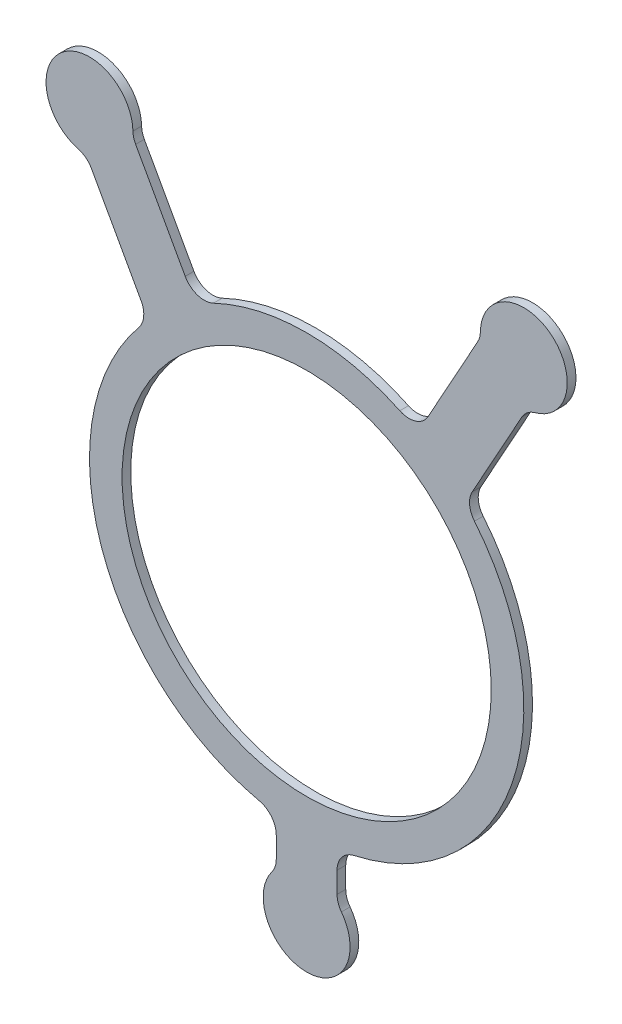
ISO-10303-21;
HEADER;
FILE_DESCRIPTION(('STEP AP214'),'2;1');
FILE_NAME('part.step','',(''),(''),'','','');
FILE_SCHEMA(('AUTOMOTIVE_DESIGN { 1 0 10303 214 1 1 1 1 }'));
ENDSEC;
DATA;
#1=APPLICATION_CONTEXT('core data for automotive mechanical design processes');
#2=APPLICATION_PROTOCOL_DEFINITION('international standard','automotive_design',2000,#1);
#3=PRODUCT_CONTEXT('',#1,'mechanical');
#4=PRODUCT('Part','Part','',(#3));
#5=PRODUCT_RELATED_PRODUCT_CATEGORY('part','',(#4));
#6=PRODUCT_DEFINITION_FORMATION('','',#4);
#7=PRODUCT_DEFINITION_CONTEXT('part definition',#1,'design');
#8=PRODUCT_DEFINITION('design','',#6,#7);
#9=PRODUCT_DEFINITION_SHAPE('','',#8);
#10=(LENGTH_UNIT() NAMED_UNIT(*) SI_UNIT(.MILLI.,.METRE.));
#11=(NAMED_UNIT(*) PLANE_ANGLE_UNIT() SI_UNIT($,.RADIAN.));
#12=(NAMED_UNIT(*) SI_UNIT($,.STERADIAN.) SOLID_ANGLE_UNIT());
#13=UNCERTAINTY_MEASURE_WITH_UNIT(LENGTH_MEASURE(1.E-05),#10,'distance_accuracy_value','');
#14=(GEOMETRIC_REPRESENTATION_CONTEXT(3) GLOBAL_UNCERTAINTY_ASSIGNED_CONTEXT((#13)) GLOBAL_UNIT_ASSIGNED_CONTEXT((#10,
#11,#12)) REPRESENTATION_CONTEXT('',''));
#15=CARTESIAN_POINT('',(0.,0.,0.));
#16=DIRECTION('',(0.,0.,1.));
#17=DIRECTION('',(1.,0.,0.));
#18=AXIS2_PLACEMENT_3D('',#15,#16,#17);
#19=CARTESIAN_POINT('',(-53.9762118068196,130.059986849951,2.54));
#20=DIRECTION('',(0.,0.,-1.));
#21=DIRECTION('',(-1.,0.,0.));
#22=AXIS2_PLACEMENT_3D('',#19,#20,#21);
#23=PLANE('',#22);
#24=CARTESIAN_POINT('',(-53.9762118068196,130.059986849951,2.54));
#25=DIRECTION('',(0.,0.,-1.));
#26=DIRECTION('',(-1.,0.,0.));
#27=AXIS2_PLACEMENT_3D('',#24,#25,#26);
#28=CIRCLE('',#27,6.34999999999999);
#29=CARTESIAN_POINT('',(-48.4212219063758,133.136443774071,2.54));
#30=VERTEX_POINT('',#29);
#31=CARTESIAN_POINT('',(-49.0692834607451,126.029533499956,2.54));
#32=VERTEX_POINT('',#31);
#33=EDGE_CURVE('E277',#30,#32,#28,.T.);
#34=ORIENTED_EDGE('',*,*,#33,.T.);
#35=CARTESIAN_POINT('',(0.,85.725,2.54));
#36=DIRECTION('',(0.,0.,1.));
#37=DIRECTION('',(1.,0.,0.));
#38=AXIS2_PLACEMENT_3D('',#35,#36,#37);
#39=CIRCLE('',#38,63.5);
#40=CARTESIAN_POINT('',(-13.8545454545455,23.7548332239784,2.54));
#41=VERTEX_POINT('',#40);
#42=EDGE_CURVE('E145',#32,#41,#39,.T.);
#43=ORIENTED_EDGE('',*,*,#42,.T.);
#44=CARTESIAN_POINT('',(-15.24,17.5578165463762,2.54));
#45=DIRECTION('',(0.,0.,-1.));
#46=DIRECTION('',(-1.,0.,0.));
#47=AXIS2_PLACEMENT_3D('',#44,#45,#46);
#48=CIRCLE('',#47,6.35);
#49=CARTESIAN_POINT('',(-8.89,17.5578165463762,2.54));
#50=VERTEX_POINT('',#49);
#51=EDGE_CURVE('E340',#41,#50,#48,.T.);
#52=ORIENTED_EDGE('',*,*,#51,.T.);
#53=DIRECTION('',(0.,-1.,0.));
#54=VECTOR('',#53,1.);
#55=CARTESIAN_POINT('',(-8.89,11.43,2.54));
#56=LINE('',#55,#54);
#57=CARTESIAN_POINT('',(-8.89,11.43,2.54));
#58=VERTEX_POINT('',#57);
#59=EDGE_CURVE('E359',#50,#58,#56,.T.);
#60=ORIENTED_EDGE('',*,*,#59,.T.);
#61=CARTESIAN_POINT('',(-15.24,11.43,2.54));
#62=DIRECTION('',(0.,0.,-1.));
#63=DIRECTION('',(-1.,0.,0.));
#64=AXIS2_PLACEMENT_3D('',#61,#62,#63);
#65=CIRCLE('',#64,6.35);
#66=CARTESIAN_POINT('',(-10.16,7.62,2.54));
#67=VERTEX_POINT('',#66);
#68=EDGE_CURVE('E356',#58,#67,#65,.T.);
#69=ORIENTED_EDGE('',*,*,#68,.T.);
#70=CARTESIAN_POINT('',(0.,0.,2.54));
#71=DIRECTION('',(0.,0.,1.));
#72=DIRECTION('',(1.,0.,0.));
#73=AXIS2_PLACEMENT_3D('',#70,#71,#72);
#74=CIRCLE('',#73,12.7);
#75=CARTESIAN_POINT('',(10.16,7.62,2.54));
#76=VERTEX_POINT('',#75);
#77=EDGE_CURVE('E358',#67,#76,#74,.T.);
#78=ORIENTED_EDGE('',*,*,#77,.T.);
#79=CARTESIAN_POINT('',(15.24,11.43,2.54));
#80=DIRECTION('',(0.,0.,-1.));
#81=DIRECTION('',(-1.,0.,0.));
#82=AXIS2_PLACEMENT_3D('',#79,#80,#81);
#83=CIRCLE('',#82,6.35);
#84=CARTESIAN_POINT('',(8.89,11.43,2.54));
#85=VERTEX_POINT('',#84);
#86=EDGE_CURVE('E361',#76,#85,#83,.T.);
#87=ORIENTED_EDGE('',*,*,#86,.T.);
#88=DIRECTION('',(0.,1.,0.));
#89=VECTOR('',#88,1.);
#90=CARTESIAN_POINT('',(8.89,11.43,2.54));
#91=LINE('',#90,#89);
#92=CARTESIAN_POINT('',(8.89,17.5578165463762,2.54));
#93=VERTEX_POINT('',#92);
#94=EDGE_CURVE('E367',#85,#93,#91,.T.);
#95=ORIENTED_EDGE('',*,*,#94,.T.);
#96=CARTESIAN_POINT('',(15.24,17.5578165463762,2.54));
#97=DIRECTION('',(0.,0.,-1.));
#98=DIRECTION('',(-1.,0.,0.));
#99=AXIS2_PLACEMENT_3D('',#96,#97,#98);
#100=CIRCLE('',#99,6.35);
#101=CARTESIAN_POINT('',(13.8545454545455,23.7548332239784,2.54));
#102=VERTEX_POINT('',#101);
#103=EDGE_CURVE('E369',#93,#102,#100,.T.);
#104=ORIENTED_EDGE('',*,*,#103,.T.);
#105=CARTESIAN_POINT('',(0.,85.725,2.54));
#106=DIRECTION('',(0.,0.,1.));
#107=DIRECTION('',(1.,0.,0.));
#108=AXIS2_PLACEMENT_3D('',#105,#106,#107);
#109=CIRCLE('',#108,63.5);
#110=CARTESIAN_POINT('',(49.0692834607453,126.029533499955,2.54));
#111=VERTEX_POINT('',#110);
#112=EDGE_CURVE('E371',#102,#111,#109,.T.);
#113=ORIENTED_EDGE('',*,*,#112,.T.);
#114=CARTESIAN_POINT('',(53.9762118068198,130.059986849951,2.54));
#115=DIRECTION('',(0.,0.,-1.));
#116=DIRECTION('',(-1.,0.,0.));
#117=AXIS2_PLACEMENT_3D('',#114,#115,#116);
#118=CIRCLE('',#117,6.34999999999999);
#119=CARTESIAN_POINT('',(48.4212219063759,133.136443774071,2.54));
#120=VERTEX_POINT('',#119);
#121=EDGE_CURVE('E373',#111,#120,#118,.T.);
#122=ORIENTED_EDGE('',*,*,#121,.T.);
#123=DIRECTION('',(0.484481405373256,0.874801559125014,0.));
#124=VECTOR('',#123,1.);
#125=CARTESIAN_POINT('',(62.9176901553753,159.31192313279,2.54));
#126=LINE('',#125,#124);
#127=CARTESIAN_POINT('',(62.9176901553753,159.31192313279,2.54));
#128=VERTEX_POINT('',#127);
#129=EDGE_CURVE('E375',#120,#128,#126,.T.);
#130=ORIENTED_EDGE('',*,*,#129,.T.);
#131=CARTESIAN_POINT('',(68.4726800558191,156.23546620867,2.54));
#132=DIRECTION('',(0.,0.,-1.));
#133=DIRECTION('',(-1.,0.,0.));
#134=AXIS2_PLACEMENT_3D('',#131,#132,#133);
#135=CIRCLE('',#134,6.35);
#136=CARTESIAN_POINT('',(66.8151200372129,162.36531080578,2.54));
#137=VERTEX_POINT('',#136);
#138=EDGE_CURVE('E377',#128,#137,#135,.T.);
#139=ORIENTED_EDGE('',*,*,#138,.T.);
#140=CARTESIAN_POINT('',(63.5000000000005,174.625,2.54));
#141=DIRECTION('',(0.,0.,1.));
#142=DIRECTION('',(-1.,0.,0.));
#143=AXIS2_PLACEMENT_3D('',#140,#141,#142);
#144=CIRCLE('',#143,12.7);
#145=CARTESIAN_POINT('',(50.8024647631299,174.875197738658,2.54));
#146=VERTEX_POINT('',#145);
#147=EDGE_CURVE('E379',#137,#146,#144,.T.);
#148=ORIENTED_EDGE('',*,*,#147,.T.);
#149=CARTESIAN_POINT('',(44.4536971446946,175.000296607987,2.54));
#150=DIRECTION('',(0.,0.,-1.));
#151=DIRECTION('',(1.,0.,0.));
#152=AXIS2_PLACEMENT_3D('',#149,#150,#151);
#153=CIRCLE('',#152,6.35);
#154=CARTESIAN_POINT('',(50.008687045138,171.923839683866,2.54));
#155=VERTEX_POINT('',#154);
#156=EDGE_CURVE('E381',#146,#155,#153,.T.);
#157=ORIENTED_EDGE('',*,*,#156,.T.);
#158=DIRECTION('',(-0.48448140537337,-0.87480155912495,0.));
#159=VECTOR('',#158,1.);
#160=CARTESIAN_POINT('',(50.008687045138,171.923839683866,2.54));
#161=LINE('',#160,#159);
#162=CARTESIAN_POINT('',(35.5122187961348,145.748360325148,2.54));
#163=VERTEX_POINT('',#162);
#164=EDGE_CURVE('E383',#155,#163,#161,.T.);
#165=ORIENTED_EDGE('',*,*,#164,.T.);
#166=CARTESIAN_POINT('',(29.9572288956914,148.824817249269,2.54));
#167=DIRECTION('',(0.,0.,-1.));
#168=DIRECTION('',(-1.,0.,0.));
#169=AXIS2_PLACEMENT_3D('',#166,#167,#168);
#170=CIRCLE('',#169,6.34999999999999);
#171=CARTESIAN_POINT('',(27.2338444506285,143.088470226608,2.54));
#172=VERTEX_POINT('',#171);
#173=EDGE_CURVE('E385',#163,#172,#170,.T.);
#174=ORIENTED_EDGE('',*,*,#173,.T.);
#175=CARTESIAN_POINT('',(0.,85.725,2.54));
#176=DIRECTION('',(0.,0.,1.));
#177=DIRECTION('',(1.,0.,0.));
#178=AXIS2_PLACEMENT_3D('',#175,#176,#177);
#179=CIRCLE('',#178,63.5);
#180=CARTESIAN_POINT('',(-27.2338444506317,143.088470226607,2.54));
#181=VERTEX_POINT('',#180);
#182=EDGE_CURVE('E387',#172,#181,#179,.T.);
#183=ORIENTED_EDGE('',*,*,#182,.T.);
#184=CARTESIAN_POINT('',(-29.9572288956949,148.824817249267,2.54));
#185=DIRECTION('',(0.,0.,-1.));
#186=DIRECTION('',(-1.,0.,0.));
#187=AXIS2_PLACEMENT_3D('',#184,#185,#186);
#188=CIRCLE('',#187,6.35);
#189=CARTESIAN_POINT('',(-35.5122187961387,145.748360325147,2.54));
#190=VERTEX_POINT('',#189);
#191=EDGE_CURVE('E389',#181,#190,#188,.T.);
#192=ORIENTED_EDGE('',*,*,#191,.T.);
#193=DIRECTION('',(-0.484481405373266,0.874801559125008,0.));
#194=VECTOR('',#193,1.);
#195=CARTESIAN_POINT('',(-50.0086870451384,171.923839683866,2.54));
#196=LINE('',#195,#194);
#197=CARTESIAN_POINT('',(-50.0086870451384,171.923839683866,2.54));
#198=VERTEX_POINT('',#197);
#199=EDGE_CURVE('E391',#190,#198,#196,.T.);
#200=ORIENTED_EDGE('',*,*,#199,.T.);
#201=CARTESIAN_POINT('',(-44.4536971446946,175.000296607986,2.54));
#202=DIRECTION('',(0.,0.,-1.));
#203=DIRECTION('',(-1.,0.,0.));
#204=AXIS2_PLACEMENT_3D('',#201,#202,#203);
#205=CIRCLE('',#204,6.34999999999999);
#206=CARTESIAN_POINT('',(-50.8024647631299,174.875197738658,2.54));
#207=VERTEX_POINT('',#206);
#208=EDGE_CURVE('E212',#198,#207,#205,.T.);
#209=ORIENTED_EDGE('',*,*,#208,.T.);
#210=CARTESIAN_POINT('',(-63.5000000000005,174.625,2.54));
#211=DIRECTION('',(0.,0.,1.));
#212=DIRECTION('',(1.,0.,0.));
#213=AXIS2_PLACEMENT_3D('',#210,#211,#212);
#214=CIRCLE('',#213,12.7);
#215=CARTESIAN_POINT('',(-66.815120037213,162.36531080578,2.54));
#216=VERTEX_POINT('',#215);
#217=EDGE_CURVE('E206',#207,#216,#214,.T.);
#218=ORIENTED_EDGE('',*,*,#217,.T.);
#219=CARTESIAN_POINT('',(-68.4726800558193,156.23546620867,2.54));
#220=DIRECTION('',(0.,0.,-1.));
#221=DIRECTION('',(-1.,0.,0.));
#222=AXIS2_PLACEMENT_3D('',#219,#220,#221);
#223=CIRCLE('',#222,6.35);
#224=CARTESIAN_POINT('',(-62.9176901553755,159.31192313279,2.54));
#225=VERTEX_POINT('',#224);
#226=EDGE_CURVE('E210',#216,#225,#223,.T.);
#227=ORIENTED_EDGE('',*,*,#226,.T.);
#228=DIRECTION('',(0.484481405373267,-0.874801559125008,0.));
#229=VECTOR('',#228,1.);
#230=CARTESIAN_POINT('',(-62.9176901553755,159.31192313279,2.54));
#231=LINE('',#230,#229);
#232=EDGE_CURVE('E54',#225,#30,#231,.T.);
#233=ORIENTED_EDGE('',*,*,#232,.T.);
#234=EDGE_LOOP('',(#34,#43,#52,#60,#69,#78,#87,#95,#104,#113,#122,#130,#139,#148,#157,#165,#174,
#183,#192,#200,#209,#218,#227,#233));
#235=FACE_BOUND('',#234,.T.);
#236=CARTESIAN_POINT('',(0.,85.725,2.54));
#237=DIRECTION('',(0.,0.,1.));
#238=DIRECTION('',(1.,0.,0.));
#239=AXIS2_PLACEMENT_3D('',#236,#237,#238);
#240=CIRCLE('',#239,53.975);
#241=CARTESIAN_POINT('',(53.975,85.725,2.54));
#242=VERTEX_POINT('',#241);
#243=EDGE_CURVE('E234',#242,#242,#240,.T.);
#244=ORIENTED_EDGE('',*,*,#243,.F.);
#245=EDGE_LOOP('',(#244));
#246=FACE_BOUND('',#245,.T.);
#247=ADVANCED_FACE('F37',(#235,#246),#23,.F.);
#248=CARTESIAN_POINT('',(-53.9762118068196,130.059986849951,0.));
#249=DIRECTION('',(0.,0.,-1.));
#250=DIRECTION('',(-1.,0.,0.));
#251=AXIS2_PLACEMENT_3D('',#248,#249,#250);
#252=PLANE('',#251);
#253=CARTESIAN_POINT('',(-53.9762118068196,130.059986849951,0.));
#254=DIRECTION('',(0.,0.,-1.));
#255=DIRECTION('',(-1.,0.,0.));
#256=AXIS2_PLACEMENT_3D('',#253,#254,#255);
#257=CIRCLE('',#256,6.34999999999999);
#258=CARTESIAN_POINT('',(-48.4212219063758,133.136443774071,0.));
#259=VERTEX_POINT('',#258);
#260=CARTESIAN_POINT('',(-49.0692834607451,126.029533499956,0.));
#261=VERTEX_POINT('',#260);
#262=EDGE_CURVE('E230',#259,#261,#257,.T.);
#263=ORIENTED_EDGE('',*,*,#262,.F.);
#264=DIRECTION('',(0.484481405373267,-0.874801559125008,0.));
#265=VECTOR('',#264,1.);
#266=CARTESIAN_POINT('',(-62.9176901553755,159.31192313279,0.));
#267=LINE('',#266,#265);
#268=CARTESIAN_POINT('',(-62.9176901553755,159.31192313279,0.));
#269=VERTEX_POINT('',#268);
#270=EDGE_CURVE('E137',#269,#259,#267,.T.);
#271=ORIENTED_EDGE('',*,*,#270,.F.);
#272=CARTESIAN_POINT('',(-68.4726800558193,156.23546620867,0.));
#273=DIRECTION('',(0.,0.,-1.));
#274=DIRECTION('',(-1.,0.,0.));
#275=AXIS2_PLACEMENT_3D('',#272,#273,#274);
#276=CIRCLE('',#275,6.35);
#277=CARTESIAN_POINT('',(-66.815120037213,162.36531080578,0.));
#278=VERTEX_POINT('',#277);
#279=EDGE_CURVE('E131',#278,#269,#276,.T.);
#280=ORIENTED_EDGE('',*,*,#279,.F.);
#281=CARTESIAN_POINT('',(-63.5000000000005,174.625,0.));
#282=DIRECTION('',(0.,0.,1.));
#283=DIRECTION('',(1.,0.,0.));
#284=AXIS2_PLACEMENT_3D('',#281,#282,#283);
#285=CIRCLE('',#284,12.7);
#286=CARTESIAN_POINT('',(-50.8024647631299,174.875197738658,0.));
#287=VERTEX_POINT('',#286);
#288=EDGE_CURVE('E220',#287,#278,#285,.T.);
#289=ORIENTED_EDGE('',*,*,#288,.F.);
#290=CARTESIAN_POINT('',(-44.4536971446946,175.000296607986,0.));
#291=DIRECTION('',(0.,0.,-1.));
#292=DIRECTION('',(-1.,0.,0.));
#293=AXIS2_PLACEMENT_3D('',#290,#291,#292);
#294=CIRCLE('',#293,6.34999999999999);
#295=CARTESIAN_POINT('',(-50.0086870451384,171.923839683866,0.));
#296=VERTEX_POINT('',#295);
#297=EDGE_CURVE('E272',#296,#287,#294,.T.);
#298=ORIENTED_EDGE('',*,*,#297,.F.);
#299=DIRECTION('',(-0.484481405373266,0.874801559125008,0.));
#300=VECTOR('',#299,1.);
#301=CARTESIAN_POINT('',(-50.0086870451384,171.923839683866,0.));
#302=LINE('',#301,#300);
#303=CARTESIAN_POINT('',(-35.5122187961387,145.748360325147,0.));
#304=VERTEX_POINT('',#303);
#305=EDGE_CURVE('E270',#304,#296,#302,.T.);
#306=ORIENTED_EDGE('',*,*,#305,.F.);
#307=CARTESIAN_POINT('',(-29.9572288956949,148.824817249267,0.));
#308=DIRECTION('',(0.,0.,-1.));
#309=DIRECTION('',(-1.,0.,0.));
#310=AXIS2_PLACEMENT_3D('',#307,#308,#309);
#311=CIRCLE('',#310,6.35);
#312=CARTESIAN_POINT('',(-27.2338444506317,143.088470226607,0.));
#313=VERTEX_POINT('',#312);
#314=EDGE_CURVE('E268',#313,#304,#311,.T.);
#315=ORIENTED_EDGE('',*,*,#314,.F.);
#316=CARTESIAN_POINT('',(0.,85.725,0.));
#317=DIRECTION('',(0.,0.,1.));
#318=DIRECTION('',(1.,0.,0.));
#319=AXIS2_PLACEMENT_3D('',#316,#317,#318);
#320=CIRCLE('',#319,63.5);
#321=CARTESIAN_POINT('',(27.2338444506285,143.088470226608,0.));
#322=VERTEX_POINT('',#321);
#323=EDGE_CURVE('E266',#322,#313,#320,.T.);
#324=ORIENTED_EDGE('',*,*,#323,.F.);
#325=CARTESIAN_POINT('',(29.9572288956914,148.824817249269,0.));
#326=DIRECTION('',(0.,0.,-1.));
#327=DIRECTION('',(-1.,0.,0.));
#328=AXIS2_PLACEMENT_3D('',#325,#326,#327);
#329=CIRCLE('',#328,6.34999999999999);
#330=CARTESIAN_POINT('',(35.5122187961348,145.748360325148,0.));
#331=VERTEX_POINT('',#330);
#332=EDGE_CURVE('E264',#331,#322,#329,.T.);
#333=ORIENTED_EDGE('',*,*,#332,.F.);
#334=DIRECTION('',(-0.48448140537337,-0.87480155912495,0.));
#335=VECTOR('',#334,1.);
#336=CARTESIAN_POINT('',(50.008687045138,171.923839683866,0.));
#337=LINE('',#336,#335);
#338=CARTESIAN_POINT('',(50.008687045138,171.923839683866,0.));
#339=VERTEX_POINT('',#338);
#340=EDGE_CURVE('E262',#339,#331,#337,.T.);
#341=ORIENTED_EDGE('',*,*,#340,.F.);
#342=CARTESIAN_POINT('',(44.4536971446946,175.000296607987,0.));
#343=DIRECTION('',(0.,0.,-1.));
#344=DIRECTION('',(1.,0.,0.));
#345=AXIS2_PLACEMENT_3D('',#342,#343,#344);
#346=CIRCLE('',#345,6.35);
#347=CARTESIAN_POINT('',(50.8024647631299,174.875197738658,0.));
#348=VERTEX_POINT('',#347);
#349=EDGE_CURVE('E260',#348,#339,#346,.T.);
#350=ORIENTED_EDGE('',*,*,#349,.F.);
#351=CARTESIAN_POINT('',(63.5000000000005,174.625,0.));
#352=DIRECTION('',(0.,0.,1.));
#353=DIRECTION('',(-1.,0.,0.));
#354=AXIS2_PLACEMENT_3D('',#351,#352,#353);
#355=CIRCLE('',#354,12.7);
#356=CARTESIAN_POINT('',(66.8151200372129,162.36531080578,0.));
#357=VERTEX_POINT('',#356);
#358=EDGE_CURVE('E258',#357,#348,#355,.T.);
#359=ORIENTED_EDGE('',*,*,#358,.F.);
#360=CARTESIAN_POINT('',(68.4726800558191,156.23546620867,0.));
#361=DIRECTION('',(0.,0.,-1.));
#362=DIRECTION('',(-1.,0.,0.));
#363=AXIS2_PLACEMENT_3D('',#360,#361,#362);
#364=CIRCLE('',#363,6.35);
#365=CARTESIAN_POINT('',(62.9176901553753,159.31192313279,0.));
#366=VERTEX_POINT('',#365);
#367=EDGE_CURVE('E256',#366,#357,#364,.T.);
#368=ORIENTED_EDGE('',*,*,#367,.F.);
#369=DIRECTION('',(0.484481405373256,0.874801559125014,0.));
#370=VECTOR('',#369,1.);
#371=CARTESIAN_POINT('',(62.9176901553753,159.31192313279,0.));
#372=LINE('',#371,#370);
#373=CARTESIAN_POINT('',(48.4212219063759,133.136443774071,0.));
#374=VERTEX_POINT('',#373);
#375=EDGE_CURVE('E254',#374,#366,#372,.T.);
#376=ORIENTED_EDGE('',*,*,#375,.F.);
#377=CARTESIAN_POINT('',(53.9762118068198,130.059986849951,0.));
#378=DIRECTION('',(0.,0.,-1.));
#379=DIRECTION('',(-1.,0.,0.));
#380=AXIS2_PLACEMENT_3D('',#377,#378,#379);
#381=CIRCLE('',#380,6.34999999999999);
#382=CARTESIAN_POINT('',(49.0692834607453,126.029533499955,0.));
#383=VERTEX_POINT('',#382);
#384=EDGE_CURVE('E252',#383,#374,#381,.T.);
#385=ORIENTED_EDGE('',*,*,#384,.F.);
#386=CARTESIAN_POINT('',(0.,85.725,0.));
#387=DIRECTION('',(0.,0.,1.));
#388=DIRECTION('',(1.,0.,0.));
#389=AXIS2_PLACEMENT_3D('',#386,#387,#388);
#390=CIRCLE('',#389,63.5);
#391=CARTESIAN_POINT('',(13.8545454545455,23.7548332239784,0.));
#392=VERTEX_POINT('',#391);
#393=EDGE_CURVE('E250',#392,#383,#390,.T.);
#394=ORIENTED_EDGE('',*,*,#393,.F.);
#395=CARTESIAN_POINT('',(15.24,17.5578165463762,0.));
#396=DIRECTION('',(0.,0.,-1.));
#397=DIRECTION('',(-1.,0.,0.));
#398=AXIS2_PLACEMENT_3D('',#395,#396,#397);
#399=CIRCLE('',#398,6.35);
#400=CARTESIAN_POINT('',(8.89,17.5578165463762,0.));
#401=VERTEX_POINT('',#400);
#402=EDGE_CURVE('E248',#401,#392,#399,.T.);
#403=ORIENTED_EDGE('',*,*,#402,.F.);
#404=DIRECTION('',(0.,1.,0.));
#405=VECTOR('',#404,1.);
#406=CARTESIAN_POINT('',(8.89,11.43,0.));
#407=LINE('',#406,#405);
#408=CARTESIAN_POINT('',(8.89,11.43,0.));
#409=VERTEX_POINT('',#408);
#410=EDGE_CURVE('E246',#409,#401,#407,.T.);
#411=ORIENTED_EDGE('',*,*,#410,.F.);
#412=CARTESIAN_POINT('',(15.24,11.43,0.));
#413=DIRECTION('',(0.,0.,-1.));
#414=DIRECTION('',(-1.,0.,0.));
#415=AXIS2_PLACEMENT_3D('',#412,#413,#414);
#416=CIRCLE('',#415,6.35);
#417=CARTESIAN_POINT('',(10.16,7.62,0.));
#418=VERTEX_POINT('',#417);
#419=EDGE_CURVE('E244',#418,#409,#416,.T.);
#420=ORIENTED_EDGE('',*,*,#419,.F.);
#421=CARTESIAN_POINT('',(0.,0.,0.));
#422=DIRECTION('',(0.,0.,1.));
#423=DIRECTION('',(1.,0.,0.));
#424=AXIS2_PLACEMENT_3D('',#421,#422,#423);
#425=CIRCLE('',#424,12.7);
#426=CARTESIAN_POINT('',(-10.16,7.62,0.));
#427=VERTEX_POINT('',#426);
#428=EDGE_CURVE('E242',#427,#418,#425,.T.);
#429=ORIENTED_EDGE('',*,*,#428,.F.);
#430=CARTESIAN_POINT('',(-15.24,11.43,0.));
#431=DIRECTION('',(0.,0.,-1.));
#432=DIRECTION('',(-1.,0.,0.));
#433=AXIS2_PLACEMENT_3D('',#430,#431,#432);
#434=CIRCLE('',#433,6.35);
#435=CARTESIAN_POINT('',(-8.89,11.43,0.));
#436=VERTEX_POINT('',#435);
#437=EDGE_CURVE('E240',#436,#427,#434,.T.);
#438=ORIENTED_EDGE('',*,*,#437,.F.);
#439=DIRECTION('',(0.,-1.,0.));
#440=VECTOR('',#439,1.);
#441=CARTESIAN_POINT('',(-8.89,11.43,0.));
#442=LINE('',#441,#440);
#443=CARTESIAN_POINT('',(-8.89,17.5578165463762,0.));
#444=VERTEX_POINT('',#443);
#445=EDGE_CURVE('E238',#444,#436,#442,.T.);
#446=ORIENTED_EDGE('',*,*,#445,.F.);
#447=CARTESIAN_POINT('',(-15.24,17.5578165463762,0.));
#448=DIRECTION('',(0.,0.,-1.));
#449=DIRECTION('',(-1.,0.,0.));
#450=AXIS2_PLACEMENT_3D('',#447,#448,#449);
#451=CIRCLE('',#450,6.35);
#452=CARTESIAN_POINT('',(-13.8545454545455,23.7548332239784,0.));
#453=VERTEX_POINT('',#452);
#454=EDGE_CURVE('E236',#453,#444,#451,.T.);
#455=ORIENTED_EDGE('',*,*,#454,.F.);
#456=CARTESIAN_POINT('',(0.,85.725,0.));
#457=DIRECTION('',(0.,0.,1.));
#458=DIRECTION('',(1.,0.,0.));
#459=AXIS2_PLACEMENT_3D('',#456,#457,#458);
#460=CIRCLE('',#459,63.5);
#461=EDGE_CURVE('E233',#261,#453,#460,.T.);
#462=ORIENTED_EDGE('',*,*,#461,.F.);
#463=EDGE_LOOP('',(#263,#271,#280,#289,#298,#306,#315,#324,#333,#341,#350,#359,#368,#376,#385,
#394,#403,#411,#420,#429,#438,#446,#455,#462));
#464=FACE_BOUND('',#463,.T.);
#465=CARTESIAN_POINT('',(0.,85.725,0.));
#466=DIRECTION('',(0.,0.,1.));
#467=DIRECTION('',(1.,0.,0.));
#468=AXIS2_PLACEMENT_3D('',#465,#466,#467);
#469=CIRCLE('',#468,53.975);
#470=CARTESIAN_POINT('',(53.975,85.725,0.));
#471=VERTEX_POINT('',#470);
#472=EDGE_CURVE('E748',#471,#471,#469,.T.);
#473=ORIENTED_EDGE('',*,*,#472,.T.);
#474=EDGE_LOOP('',(#473));
#475=FACE_BOUND('',#474,.T.);
#476=ADVANCED_FACE('F344',(#464,#475),#252,.T.);
#477=CARTESIAN_POINT('',(-53.9762118068196,130.059986849951,2.54));
#478=DIRECTION('',(0.,0.,-1.));
#479=DIRECTION('',(-1.,0.,0.));
#480=AXIS2_PLACEMENT_3D('',#477,#478,#479);
#481=CYLINDRICAL_SURFACE('',#480,6.34999999999999);
#482=ORIENTED_EDGE('',*,*,#262,.T.);
#483=DIRECTION('',(0.,0.,-1.));
#484=VECTOR('',#483,1.);
#485=CARTESIAN_POINT('',(-49.0692834607451,126.029533499956,2.54));
#486=LINE('',#485,#484);
#487=EDGE_CURVE('E11',#32,#261,#486,.T.);
#488=ORIENTED_EDGE('',*,*,#487,.F.);
#489=ORIENTED_EDGE('',*,*,#33,.F.);
#490=DIRECTION('',(0.,0.,-1.));
#491=VECTOR('',#490,1.);
#492=CARTESIAN_POINT('',(-48.4212219063758,133.136443774071,2.54));
#493=LINE('',#492,#491);
#494=EDGE_CURVE('E226',#30,#259,#493,.T.);
#495=ORIENTED_EDGE('',*,*,#494,.T.);
#496=EDGE_LOOP('',(#482,#488,#489,#495));
#497=FACE_BOUND('',#496,.T.);
#498=ADVANCED_FACE('F39',(#497),#481,.F.);
#499=CARTESIAN_POINT('',(0.,85.725,2.54));
#500=DIRECTION('',(0.,0.,-1.));
#501=DIRECTION('',(-1.,0.,0.));
#502=AXIS2_PLACEMENT_3D('',#499,#500,#501);
#503=CYLINDRICAL_SURFACE('',#502,63.5);
#504=ORIENTED_EDGE('',*,*,#461,.T.);
#505=DIRECTION('',(0.,0.,-1.));
#506=VECTOR('',#505,1.);
#507=CARTESIAN_POINT('',(-13.8545454545455,23.7548332239784,2.54));
#508=LINE('',#507,#506);
#509=EDGE_CURVE('E46',#41,#453,#508,.T.);
#510=ORIENTED_EDGE('',*,*,#509,.F.);
#511=ORIENTED_EDGE('',*,*,#42,.F.);
#512=ORIENTED_EDGE('',*,*,#487,.T.);
#513=EDGE_LOOP('',(#504,#510,#511,#512));
#514=FACE_BOUND('',#513,.T.);
#515=ADVANCED_FACE('F425',(#514),#503,.T.);
#516=CARTESIAN_POINT('',(-15.24,17.5578165463762,2.54));
#517=DIRECTION('',(0.,0.,-1.));
#518=DIRECTION('',(-1.,0.,0.));
#519=AXIS2_PLACEMENT_3D('',#516,#517,#518);
#520=CYLINDRICAL_SURFACE('',#519,6.35);
#521=ORIENTED_EDGE('',*,*,#454,.T.);
#522=DIRECTION('',(0.,0.,-1.));
#523=VECTOR('',#522,1.);
#524=CARTESIAN_POINT('',(-8.89,17.5578165463762,2.54));
#525=LINE('',#524,#523);
#526=EDGE_CURVE('E332',#50,#444,#525,.T.);
#527=ORIENTED_EDGE('',*,*,#526,.F.);
#528=ORIENTED_EDGE('',*,*,#51,.F.);
#529=ORIENTED_EDGE('',*,*,#509,.T.);
#530=EDGE_LOOP('',(#521,#527,#528,#529));
#531=FACE_BOUND('',#530,.T.);
#532=ADVANCED_FACE('F338',(#531),#520,.F.);
#533=CARTESIAN_POINT('',(-8.89,11.43,2.54));
#534=DIRECTION('',(1.,0.,0.));
#535=DIRECTION('',(0.,0.,-1.));
#536=AXIS2_PLACEMENT_3D('',#533,#534,#535);
#537=PLANE('',#536);
#538=ORIENTED_EDGE('',*,*,#445,.T.);
#539=DIRECTION('',(0.,0.,-1.));
#540=VECTOR('',#539,1.);
#541=CARTESIAN_POINT('',(-8.89,11.43,2.54));
#542=LINE('',#541,#540);
#543=EDGE_CURVE('E329',#58,#436,#542,.T.);
#544=ORIENTED_EDGE('',*,*,#543,.F.);
#545=ORIENTED_EDGE('',*,*,#59,.F.);
#546=ORIENTED_EDGE('',*,*,#526,.T.);
#547=EDGE_LOOP('',(#538,#544,#545,#546));
#548=FACE_BOUND('',#547,.T.);
#549=ADVANCED_FACE('F350',(#548),#537,.F.);
#550=CARTESIAN_POINT('',(-15.24,11.43,2.54));
#551=DIRECTION('',(0.,0.,-1.));
#552=DIRECTION('',(-1.,0.,0.));
#553=AXIS2_PLACEMENT_3D('',#550,#551,#552);
#554=CYLINDRICAL_SURFACE('',#553,6.35);
#555=ORIENTED_EDGE('',*,*,#437,.T.);
#556=DIRECTION('',(0.,0.,-1.));
#557=VECTOR('',#556,1.);
#558=CARTESIAN_POINT('',(-10.16,7.62,2.54));
#559=LINE('',#558,#557);
#560=EDGE_CURVE('E326',#67,#427,#559,.T.);
#561=ORIENTED_EDGE('',*,*,#560,.F.);
#562=ORIENTED_EDGE('',*,*,#68,.F.);
#563=ORIENTED_EDGE('',*,*,#543,.T.);
#564=EDGE_LOOP('',(#555,#561,#562,#563));
#565=FACE_BOUND('',#564,.T.);
#566=ADVANCED_FACE('F354',(#565),#554,.F.);
#567=CARTESIAN_POINT('',(0.,0.,2.54));
#568=DIRECTION('',(0.,0.,-1.));
#569=DIRECTION('',(-1.,0.,0.));
#570=AXIS2_PLACEMENT_3D('',#567,#568,#569);
#571=CYLINDRICAL_SURFACE('',#570,12.7);
#572=ORIENTED_EDGE('',*,*,#428,.T.);
#573=DIRECTION('',(0.,0.,-1.));
#574=VECTOR('',#573,1.);
#575=CARTESIAN_POINT('',(10.16,7.62,2.54));
#576=LINE('',#575,#574);
#577=EDGE_CURVE('E323',#76,#418,#576,.T.);
#578=ORIENTED_EDGE('',*,*,#577,.F.);
#579=ORIENTED_EDGE('',*,*,#77,.F.);
#580=ORIENTED_EDGE('',*,*,#560,.T.);
#581=EDGE_LOOP('',(#572,#578,#579,#580));
#582=FACE_BOUND('',#581,.T.);
#583=ADVANCED_FACE('F438',(#582),#571,.T.);
#584=CARTESIAN_POINT('',(15.24,11.43,2.54));
#585=DIRECTION('',(0.,0.,-1.));
#586=DIRECTION('',(-1.,0.,0.));
#587=AXIS2_PLACEMENT_3D('',#584,#585,#586);
#588=CYLINDRICAL_SURFACE('',#587,6.35);
#589=ORIENTED_EDGE('',*,*,#419,.T.);
#590=DIRECTION('',(0.,0.,-1.));
#591=VECTOR('',#590,1.);
#592=CARTESIAN_POINT('',(8.89,11.43,2.54));
#593=LINE('',#592,#591);
#594=EDGE_CURVE('E320',#85,#409,#593,.T.);
#595=ORIENTED_EDGE('',*,*,#594,.F.);
#596=ORIENTED_EDGE('',*,*,#86,.F.);
#597=ORIENTED_EDGE('',*,*,#577,.T.);
#598=EDGE_LOOP('',(#589,#595,#596,#597));
#599=FACE_BOUND('',#598,.T.);
#600=ADVANCED_FACE('F441',(#599),#588,.F.);
#601=CARTESIAN_POINT('',(8.89,11.43,2.54));
#602=DIRECTION('',(-1.,0.,0.));
#603=DIRECTION('',(0.,0.,1.));
#604=AXIS2_PLACEMENT_3D('',#601,#602,#603);
#605=PLANE('',#604);
#606=ORIENTED_EDGE('',*,*,#410,.T.);
#607=DIRECTION('',(0.,0.,-1.));
#608=VECTOR('',#607,1.);
#609=CARTESIAN_POINT('',(8.89,17.5578165463762,2.54));
#610=LINE('',#609,#608);
#611=EDGE_CURVE('E317',#93,#401,#610,.T.);
#612=ORIENTED_EDGE('',*,*,#611,.F.);
#613=ORIENTED_EDGE('',*,*,#94,.F.);
#614=ORIENTED_EDGE('',*,*,#594,.T.);
#615=EDGE_LOOP('',(#606,#612,#613,#614));
#616=FACE_BOUND('',#615,.T.);
#617=ADVANCED_FACE('F445',(#616),#605,.F.);
#618=CARTESIAN_POINT('',(15.24,17.5578165463762,2.54));
#619=DIRECTION('',(0.,0.,-1.));
#620=DIRECTION('',(-1.,0.,0.));
#621=AXIS2_PLACEMENT_3D('',#618,#619,#620);
#622=CYLINDRICAL_SURFACE('',#621,6.35);
#623=ORIENTED_EDGE('',*,*,#402,.T.);
#624=DIRECTION('',(0.,0.,-1.));
#625=VECTOR('',#624,1.);
#626=CARTESIAN_POINT('',(13.8545454545455,23.7548332239784,2.54));
#627=LINE('',#626,#625);
#628=EDGE_CURVE('E314',#102,#392,#627,.T.);
#629=ORIENTED_EDGE('',*,*,#628,.F.);
#630=ORIENTED_EDGE('',*,*,#103,.F.);
#631=ORIENTED_EDGE('',*,*,#611,.T.);
#632=EDGE_LOOP('',(#623,#629,#630,#631));
#633=FACE_BOUND('',#632,.T.);
#634=ADVANCED_FACE('F449',(#633),#622,.F.);
#635=CARTESIAN_POINT('',(0.,85.725,2.54));
#636=DIRECTION('',(0.,0.,-1.));
#637=DIRECTION('',(-1.,0.,0.));
#638=AXIS2_PLACEMENT_3D('',#635,#636,#637);
#639=CYLINDRICAL_SURFACE('',#638,63.5);
#640=ORIENTED_EDGE('',*,*,#393,.T.);
#641=DIRECTION('',(0.,0.,-1.));
#642=VECTOR('',#641,1.);
#643=CARTESIAN_POINT('',(49.0692834607453,126.029533499955,2.54));
#644=LINE('',#643,#642);
#645=EDGE_CURVE('E311',#111,#383,#644,.T.);
#646=ORIENTED_EDGE('',*,*,#645,.F.);
#647=ORIENTED_EDGE('',*,*,#112,.F.);
#648=ORIENTED_EDGE('',*,*,#628,.T.);
#649=EDGE_LOOP('',(#640,#646,#647,#648));
#650=FACE_BOUND('',#649,.T.);
#651=ADVANCED_FACE('F453',(#650),#639,.T.);
#652=CARTESIAN_POINT('',(53.9762118068198,130.059986849951,2.54));
#653=DIRECTION('',(0.,0.,-1.));
#654=DIRECTION('',(-1.,0.,0.));
#655=AXIS2_PLACEMENT_3D('',#652,#653,#654);
#656=CYLINDRICAL_SURFACE('',#655,6.34999999999999);
#657=ORIENTED_EDGE('',*,*,#384,.T.);
#658=DIRECTION('',(0.,0.,-1.));
#659=VECTOR('',#658,1.);
#660=CARTESIAN_POINT('',(48.4212219063759,133.136443774071,2.54));
#661=LINE('',#660,#659);
#662=EDGE_CURVE('E308',#120,#374,#661,.T.);
#663=ORIENTED_EDGE('',*,*,#662,.F.);
#664=ORIENTED_EDGE('',*,*,#121,.F.);
#665=ORIENTED_EDGE('',*,*,#645,.T.);
#666=EDGE_LOOP('',(#657,#663,#664,#665));
#667=FACE_BOUND('',#666,.T.);
#668=ADVANCED_FACE('F457',(#667),#656,.F.);
#669=CARTESIAN_POINT('',(62.9176901553753,159.31192313279,2.54));
#670=DIRECTION('',(-0.874801559125014,0.484481405373256,0.));
#671=DIRECTION('',(-0.484481405373256,-0.874801559125014,0.));
#672=AXIS2_PLACEMENT_3D('',#669,#670,#671);
#673=PLANE('',#672);
#674=ORIENTED_EDGE('',*,*,#375,.T.);
#675=DIRECTION('',(0.,0.,-1.));
#676=VECTOR('',#675,1.);
#677=CARTESIAN_POINT('',(62.9176901553753,159.31192313279,2.54));
#678=LINE('',#677,#676);
#679=EDGE_CURVE('E305',#128,#366,#678,.T.);
#680=ORIENTED_EDGE('',*,*,#679,.F.);
#681=ORIENTED_EDGE('',*,*,#129,.F.);
#682=ORIENTED_EDGE('',*,*,#662,.T.);
#683=EDGE_LOOP('',(#674,#680,#681,#682));
#684=FACE_BOUND('',#683,.T.);
#685=ADVANCED_FACE('F461',(#684),#673,.F.);
#686=CARTESIAN_POINT('',(68.4726800558191,156.23546620867,2.54));
#687=DIRECTION('',(0.,0.,-1.));
#688=DIRECTION('',(-1.,0.,0.));
#689=AXIS2_PLACEMENT_3D('',#686,#687,#688);
#690=CYLINDRICAL_SURFACE('',#689,6.35);
#691=ORIENTED_EDGE('',*,*,#367,.T.);
#692=DIRECTION('',(0.,0.,-1.));
#693=VECTOR('',#692,1.);
#694=CARTESIAN_POINT('',(66.8151200372129,162.36531080578,2.54));
#695=LINE('',#694,#693);
#696=EDGE_CURVE('E302',#137,#357,#695,.T.);
#697=ORIENTED_EDGE('',*,*,#696,.F.);
#698=ORIENTED_EDGE('',*,*,#138,.F.);
#699=ORIENTED_EDGE('',*,*,#679,.T.);
#700=EDGE_LOOP('',(#691,#697,#698,#699));
#701=FACE_BOUND('',#700,.T.);
#702=ADVANCED_FACE('F465',(#701),#690,.F.);
#703=CARTESIAN_POINT('',(63.5000000000005,174.625,2.54));
#704=DIRECTION('',(0.,0.,-1.));
#705=DIRECTION('',(-1.,0.,0.));
#706=AXIS2_PLACEMENT_3D('',#703,#704,#705);
#707=CYLINDRICAL_SURFACE('',#706,12.7);
#708=ORIENTED_EDGE('',*,*,#358,.T.);
#709=DIRECTION('',(0.,0.,-1.));
#710=VECTOR('',#709,1.);
#711=CARTESIAN_POINT('',(50.8024647631299,174.875197738658,2.54));
#712=LINE('',#711,#710);
#713=EDGE_CURVE('E299',#146,#348,#712,.T.);
#714=ORIENTED_EDGE('',*,*,#713,.F.);
#715=ORIENTED_EDGE('',*,*,#147,.F.);
#716=ORIENTED_EDGE('',*,*,#696,.T.);
#717=EDGE_LOOP('',(#708,#714,#715,#716));
#718=FACE_BOUND('',#717,.T.);
#719=ADVANCED_FACE('F469',(#718),#707,.T.);
#720=CARTESIAN_POINT('',(44.4536971446946,175.000296607987,2.54));
#721=DIRECTION('',(0.,0.,-1.));
#722=DIRECTION('',(-1.,0.,0.));
#723=AXIS2_PLACEMENT_3D('',#720,#721,#722);
#724=CYLINDRICAL_SURFACE('',#723,6.35);
#725=ORIENTED_EDGE('',*,*,#349,.T.);
#726=DIRECTION('',(0.,0.,-1.));
#727=VECTOR('',#726,1.);
#728=CARTESIAN_POINT('',(50.008687045138,171.923839683866,2.54));
#729=LINE('',#728,#727);
#730=EDGE_CURVE('E296',#155,#339,#729,.T.);
#731=ORIENTED_EDGE('',*,*,#730,.F.);
#732=ORIENTED_EDGE('',*,*,#156,.F.);
#733=ORIENTED_EDGE('',*,*,#713,.T.);
#734=EDGE_LOOP('',(#725,#731,#732,#733));
#735=FACE_BOUND('',#734,.T.);
#736=ADVANCED_FACE('F473',(#735),#724,.F.);
#737=CARTESIAN_POINT('',(50.008687045138,171.923839683866,2.54));
#738=DIRECTION('',(0.87480155912495,-0.48448140537337,0.));
#739=DIRECTION('',(0.48448140537337,0.87480155912495,0.));
#740=AXIS2_PLACEMENT_3D('',#737,#738,#739);
#741=PLANE('',#740);
#742=ORIENTED_EDGE('',*,*,#340,.T.);
#743=DIRECTION('',(0.,0.,-1.));
#744=VECTOR('',#743,1.);
#745=CARTESIAN_POINT('',(35.5122187961348,145.748360325148,2.54));
#746=LINE('',#745,#744);
#747=EDGE_CURVE('E293',#163,#331,#746,.T.);
#748=ORIENTED_EDGE('',*,*,#747,.F.);
#749=ORIENTED_EDGE('',*,*,#164,.F.);
#750=ORIENTED_EDGE('',*,*,#730,.T.);
#751=EDGE_LOOP('',(#742,#748,#749,#750));
#752=FACE_BOUND('',#751,.T.);
#753=ADVANCED_FACE('F477',(#752),#741,.F.);
#754=CARTESIAN_POINT('',(29.9572288956914,148.824817249269,2.54));
#755=DIRECTION('',(0.,0.,-1.));
#756=DIRECTION('',(-1.,0.,0.));
#757=AXIS2_PLACEMENT_3D('',#754,#755,#756);
#758=CYLINDRICAL_SURFACE('',#757,6.34999999999999);
#759=ORIENTED_EDGE('',*,*,#332,.T.);
#760=DIRECTION('',(0.,0.,-1.));
#761=VECTOR('',#760,1.);
#762=CARTESIAN_POINT('',(27.2338444506285,143.088470226608,2.54));
#763=LINE('',#762,#761);
#764=EDGE_CURVE('E290',#172,#322,#763,.T.);
#765=ORIENTED_EDGE('',*,*,#764,.F.);
#766=ORIENTED_EDGE('',*,*,#173,.F.);
#767=ORIENTED_EDGE('',*,*,#747,.T.);
#768=EDGE_LOOP('',(#759,#765,#766,#767));
#769=FACE_BOUND('',#768,.T.);
#770=ADVANCED_FACE('F481',(#769),#758,.F.);
#771=CARTESIAN_POINT('',(0.,85.725,2.54));
#772=DIRECTION('',(0.,0.,-1.));
#773=DIRECTION('',(-1.,0.,0.));
#774=AXIS2_PLACEMENT_3D('',#771,#772,#773);
#775=CYLINDRICAL_SURFACE('',#774,63.5);
#776=ORIENTED_EDGE('',*,*,#323,.T.);
#777=DIRECTION('',(0.,0.,-1.));
#778=VECTOR('',#777,1.);
#779=CARTESIAN_POINT('',(-27.2338444506317,143.088470226607,2.54));
#780=LINE('',#779,#778);
#781=EDGE_CURVE('E287',#181,#313,#780,.T.);
#782=ORIENTED_EDGE('',*,*,#781,.F.);
#783=ORIENTED_EDGE('',*,*,#182,.F.);
#784=ORIENTED_EDGE('',*,*,#764,.T.);
#785=EDGE_LOOP('',(#776,#782,#783,#784));
#786=FACE_BOUND('',#785,.T.);
#787=ADVANCED_FACE('F485',(#786),#775,.T.);
#788=CARTESIAN_POINT('',(-29.9572288956949,148.824817249267,2.54));
#789=DIRECTION('',(0.,0.,-1.));
#790=DIRECTION('',(-1.,0.,0.));
#791=AXIS2_PLACEMENT_3D('',#788,#789,#790);
#792=CYLINDRICAL_SURFACE('',#791,6.35);
#793=ORIENTED_EDGE('',*,*,#314,.T.);
#794=DIRECTION('',(0.,0.,-1.));
#795=VECTOR('',#794,1.);
#796=CARTESIAN_POINT('',(-35.5122187961387,145.748360325147,2.54));
#797=LINE('',#796,#795);
#798=EDGE_CURVE('E284',#190,#304,#797,.T.);
#799=ORIENTED_EDGE('',*,*,#798,.F.);
#800=ORIENTED_EDGE('',*,*,#191,.F.);
#801=ORIENTED_EDGE('',*,*,#781,.T.);
#802=EDGE_LOOP('',(#793,#799,#800,#801));
#803=FACE_BOUND('',#802,.T.);
#804=ADVANCED_FACE('F489',(#803),#792,.F.);
#805=CARTESIAN_POINT('',(-50.0086870451384,171.923839683866,2.54));
#806=DIRECTION('',(-0.874801559125008,-0.484481405373266,0.));
#807=DIRECTION('',(0.484481405373266,-0.874801559125008,0.));
#808=AXIS2_PLACEMENT_3D('',#805,#806,#807);
#809=PLANE('',#808);
#810=ORIENTED_EDGE('',*,*,#305,.T.);
#811=DIRECTION('',(0.,0.,-1.));
#812=VECTOR('',#811,1.);
#813=CARTESIAN_POINT('',(-50.0086870451384,171.923839683866,2.54));
#814=LINE('',#813,#812);
#815=EDGE_CURVE('E281',#198,#296,#814,.T.);
#816=ORIENTED_EDGE('',*,*,#815,.F.);
#817=ORIENTED_EDGE('',*,*,#199,.F.);
#818=ORIENTED_EDGE('',*,*,#798,.T.);
#819=EDGE_LOOP('',(#810,#816,#817,#818));
#820=FACE_BOUND('',#819,.T.);
#821=ADVANCED_FACE('F397',(#820),#809,.F.);
#822=CARTESIAN_POINT('',(-44.4536971446946,175.000296607986,2.54));
#823=DIRECTION('',(0.,0.,-1.));
#824=DIRECTION('',(-1.,0.,0.));
#825=AXIS2_PLACEMENT_3D('',#822,#823,#824);
#826=CYLINDRICAL_SURFACE('',#825,6.34999999999999);
#827=ORIENTED_EDGE('',*,*,#297,.T.);
#828=DIRECTION('',(0.,0.,-1.));
#829=VECTOR('',#828,1.);
#830=CARTESIAN_POINT('',(-50.8024647631299,174.875197738658,2.54));
#831=LINE('',#830,#829);
#832=EDGE_CURVE('E221',#207,#287,#831,.T.);
#833=ORIENTED_EDGE('',*,*,#832,.F.);
#834=ORIENTED_EDGE('',*,*,#208,.F.);
#835=ORIENTED_EDGE('',*,*,#815,.T.);
#836=EDGE_LOOP('',(#827,#833,#834,#835));
#837=FACE_BOUND('',#836,.T.);
#838=ADVANCED_FACE('F401',(#837),#826,.F.);
#839=CARTESIAN_POINT('',(-63.5000000000005,174.625,2.54));
#840=DIRECTION('',(0.,0.,-1.));
#841=DIRECTION('',(-1.,0.,0.));
#842=AXIS2_PLACEMENT_3D('',#839,#840,#841);
#843=CYLINDRICAL_SURFACE('',#842,12.7);
#844=ORIENTED_EDGE('',*,*,#288,.T.);
#845=DIRECTION('',(0.,0.,-1.));
#846=VECTOR('',#845,1.);
#847=CARTESIAN_POINT('',(-66.815120037213,162.36531080578,2.54));
#848=LINE('',#847,#846);
#849=EDGE_CURVE('E217',#216,#278,#848,.T.);
#850=ORIENTED_EDGE('',*,*,#849,.F.);
#851=ORIENTED_EDGE('',*,*,#217,.F.);
#852=ORIENTED_EDGE('',*,*,#832,.T.);
#853=EDGE_LOOP('',(#844,#850,#851,#852));
#854=FACE_BOUND('',#853,.T.);
#855=ADVANCED_FACE('F218',(#854),#843,.T.);
#856=CARTESIAN_POINT('',(-68.4726800558193,156.23546620867,2.54));
#857=DIRECTION('',(0.,0.,-1.));
#858=DIRECTION('',(-1.,0.,0.));
#859=AXIS2_PLACEMENT_3D('',#856,#857,#858);
#860=CYLINDRICAL_SURFACE('',#859,6.35);
#861=ORIENTED_EDGE('',*,*,#279,.T.);
#862=DIRECTION('',(0.,0.,-1.));
#863=VECTOR('',#862,1.);
#864=CARTESIAN_POINT('',(-62.9176901553755,159.31192313279,2.54));
#865=LINE('',#864,#863);
#866=EDGE_CURVE('E222',#225,#269,#865,.T.);
#867=ORIENTED_EDGE('',*,*,#866,.F.);
#868=ORIENTED_EDGE('',*,*,#226,.F.);
#869=ORIENTED_EDGE('',*,*,#849,.T.);
#870=EDGE_LOOP('',(#861,#867,#868,#869));
#871=FACE_BOUND('',#870,.T.);
#872=ADVANCED_FACE('F224',(#871),#860,.F.);
#873=CARTESIAN_POINT('',(-62.9176901553755,159.31192313279,2.54));
#874=DIRECTION('',(0.874801559125008,0.484481405373267,0.));
#875=DIRECTION('',(-0.484481405373267,0.874801559125008,0.));
#876=AXIS2_PLACEMENT_3D('',#873,#874,#875);
#877=PLANE('',#876);
#878=ORIENTED_EDGE('',*,*,#270,.T.);
#879=ORIENTED_EDGE('',*,*,#494,.F.);
#880=ORIENTED_EDGE('',*,*,#232,.F.);
#881=ORIENTED_EDGE('',*,*,#866,.T.);
#882=EDGE_LOOP('',(#878,#879,#880,#881));
#883=FACE_BOUND('',#882,.T.);
#884=ADVANCED_FACE('F405',(#883),#877,.F.);
#885=CARTESIAN_POINT('',(0.,85.725,2.54));
#886=DIRECTION('',(0.,0.,-1.));
#887=DIRECTION('',(-1.,0.,0.));
#888=AXIS2_PLACEMENT_3D('',#885,#886,#887);
#889=CYLINDRICAL_SURFACE('',#888,53.975);
#890=ORIENTED_EDGE('',*,*,#243,.T.);
#891=EDGE_LOOP('',(#890));
#892=FACE_BOUND('',#891,.T.);
#893=ORIENTED_EDGE('',*,*,#472,.F.);
#894=EDGE_LOOP('',(#893));
#895=FACE_BOUND('',#894,.T.);
#896=ADVANCED_FACE('F407',(#892,#895),#889,.F.);
#897=CLOSED_SHELL('',(#247,#476,#498,#515,#532,#549,#566,#583,#600,#617,#634,#651,#668,#685,
#702,#719,#736,#753,#770,#787,#804,#821,#838,#855,#872,#884,#896));
#898=MANIFOLD_SOLID_BREP('B2',#897);
#899=ADVANCED_BREP_SHAPE_REPRESENTATION('',(#18,#898),#14);
#900=SHAPE_DEFINITION_REPRESENTATION(#9,#899);
ENDSEC;
END-ISO-10303-21;
